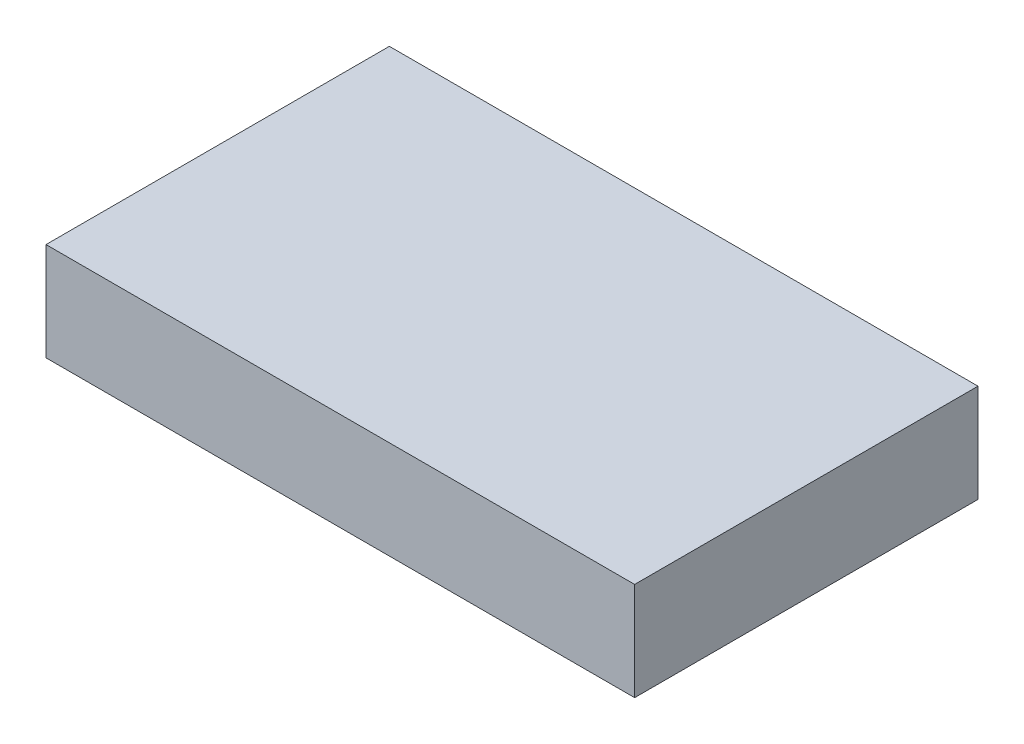
ISO-10303-21;
HEADER;
FILE_DESCRIPTION(('STEP AP214'),'2;1');
FILE_NAME('part.step','',(''),(''),'','','');
FILE_SCHEMA(('AUTOMOTIVE_DESIGN { 1 0 10303 214 1 1 1 1 }'));
ENDSEC;
DATA;
#1=APPLICATION_CONTEXT('core data for automotive mechanical design processes');
#2=APPLICATION_PROTOCOL_DEFINITION('international standard','automotive_design',2000,#1);
#3=PRODUCT_CONTEXT('',#1,'mechanical');
#4=PRODUCT('Part','Part','',(#3));
#5=PRODUCT_RELATED_PRODUCT_CATEGORY('part','',(#4));
#6=PRODUCT_DEFINITION_FORMATION('','',#4);
#7=PRODUCT_DEFINITION_CONTEXT('part definition',#1,'design');
#8=PRODUCT_DEFINITION('design','',#6,#7);
#9=PRODUCT_DEFINITION_SHAPE('','',#8);
#10=(LENGTH_UNIT() NAMED_UNIT(*) SI_UNIT(.MILLI.,.METRE.));
#11=(NAMED_UNIT(*) PLANE_ANGLE_UNIT() SI_UNIT($,.RADIAN.));
#12=(NAMED_UNIT(*) SI_UNIT($,.STERADIAN.) SOLID_ANGLE_UNIT());
#13=UNCERTAINTY_MEASURE_WITH_UNIT(LENGTH_MEASURE(1.E-05),#10,'distance_accuracy_value','');
#14=(GEOMETRIC_REPRESENTATION_CONTEXT(3) GLOBAL_UNCERTAINTY_ASSIGNED_CONTEXT((#13)) GLOBAL_UNIT_ASSIGNED_CONTEXT((#10,
#11,#12)) REPRESENTATION_CONTEXT('',''));
#15=CARTESIAN_POINT('',(0.,0.,0.));
#16=DIRECTION('',(0.,0.,1.));
#17=DIRECTION('',(1.,0.,0.));
#18=AXIS2_PLACEMENT_3D('',#15,#16,#17);
#19=CARTESIAN_POINT('',(60.,20.,-35.));
#20=DIRECTION('',(-1.,0.,0.));
#21=DIRECTION('',(0.,0.,1.));
#22=AXIS2_PLACEMENT_3D('',#19,#20,#21);
#23=PLANE('',#22);
#24=DIRECTION('',(0.,0.,-1.));
#25=VECTOR('',#24,1.);
#26=CARTESIAN_POINT('',(60.,0.,-35.));
#27=LINE('',#26,#25);
#28=CARTESIAN_POINT('',(60.,0.,35.));
#29=VERTEX_POINT('',#28);
#30=CARTESIAN_POINT('',(60.,0.,-35.));
#31=VERTEX_POINT('',#30);
#32=EDGE_CURVE('E100',#29,#31,#27,.T.);
#33=ORIENTED_EDGE('',*,*,#32,.T.);
#34=DIRECTION('',(0.,-1.,0.));
#35=VECTOR('',#34,1.);
#36=CARTESIAN_POINT('',(60.,20.,-35.));
#37=LINE('',#36,#35);
#38=CARTESIAN_POINT('',(60.,20.,-35.));
#39=VERTEX_POINT('',#38);
#40=EDGE_CURVE('E11',#39,#31,#37,.T.);
#41=ORIENTED_EDGE('',*,*,#40,.F.);
#42=DIRECTION('',(0.,0.,-1.));
#43=VECTOR('',#42,1.);
#44=CARTESIAN_POINT('',(60.,20.,-35.));
#45=LINE('',#44,#43);
#46=CARTESIAN_POINT('',(60.,20.,35.));
#47=VERTEX_POINT('',#46);
#48=EDGE_CURVE('E88',#47,#39,#45,.T.);
#49=ORIENTED_EDGE('',*,*,#48,.F.);
#50=DIRECTION('',(0.,-1.,0.));
#51=VECTOR('',#50,1.);
#52=CARTESIAN_POINT('',(60.,20.,35.));
#53=LINE('',#52,#51);
#54=EDGE_CURVE('E96',#47,#29,#53,.T.);
#55=ORIENTED_EDGE('',*,*,#54,.T.);
#56=EDGE_LOOP('',(#33,#41,#49,#55));
#57=FACE_BOUND('',#56,.T.);
#58=ADVANCED_FACE('F37',(#57),#23,.F.);
#59=CARTESIAN_POINT('',(-60.,20.,-35.));
#60=DIRECTION('',(0.,0.,1.));
#61=DIRECTION('',(1.,0.,0.));
#62=AXIS2_PLACEMENT_3D('',#59,#60,#61);
#63=PLANE('',#62);
#64=DIRECTION('',(-1.,0.,0.));
#65=VECTOR('',#64,1.);
#66=CARTESIAN_POINT('',(-60.,0.,-35.));
#67=LINE('',#66,#65);
#68=CARTESIAN_POINT('',(-60.,0.,-35.));
#69=VERTEX_POINT('',#68);
#70=EDGE_CURVE('E92',#31,#69,#67,.T.);
#71=ORIENTED_EDGE('',*,*,#70,.T.);
#72=DIRECTION('',(0.,-1.,0.));
#73=VECTOR('',#72,1.);
#74=CARTESIAN_POINT('',(-60.,20.,-35.));
#75=LINE('',#74,#73);
#76=CARTESIAN_POINT('',(-60.,20.,-35.));
#77=VERTEX_POINT('',#76);
#78=EDGE_CURVE('E45',#77,#69,#75,.T.);
#79=ORIENTED_EDGE('',*,*,#78,.F.);
#80=DIRECTION('',(-1.,0.,0.));
#81=VECTOR('',#80,1.);
#82=CARTESIAN_POINT('',(-60.,20.,-35.));
#83=LINE('',#82,#81);
#84=EDGE_CURVE('E83',#39,#77,#83,.T.);
#85=ORIENTED_EDGE('',*,*,#84,.F.);
#86=ORIENTED_EDGE('',*,*,#40,.T.);
#87=EDGE_LOOP('',(#71,#79,#85,#86));
#88=FACE_BOUND('',#87,.T.);
#89=ADVANCED_FACE('F91',(#88),#63,.F.);
#90=CARTESIAN_POINT('',(-60.,20.,-35.));
#91=DIRECTION('',(1.,0.,0.));
#92=DIRECTION('',(0.,0.,-1.));
#93=AXIS2_PLACEMENT_3D('',#90,#91,#92);
#94=PLANE('',#93);
#95=DIRECTION('',(0.,0.,1.));
#96=VECTOR('',#95,1.);
#97=CARTESIAN_POINT('',(-60.,0.,-35.));
#98=LINE('',#97,#96);
#99=CARTESIAN_POINT('',(-60.,0.,35.));
#100=VERTEX_POINT('',#99);
#101=EDGE_CURVE('E70',#69,#100,#98,.T.);
#102=ORIENTED_EDGE('',*,*,#101,.T.);
#103=DIRECTION('',(0.,-1.,0.));
#104=VECTOR('',#103,1.);
#105=CARTESIAN_POINT('',(-60.,20.,35.));
#106=LINE('',#105,#104);
#107=CARTESIAN_POINT('',(-60.,20.,35.));
#108=VERTEX_POINT('',#107);
#109=EDGE_CURVE('E93',#108,#100,#106,.T.);
#110=ORIENTED_EDGE('',*,*,#109,.F.);
#111=DIRECTION('',(0.,0.,1.));
#112=VECTOR('',#111,1.);
#113=CARTESIAN_POINT('',(-60.,20.,-35.));
#114=LINE('',#113,#112);
#115=EDGE_CURVE('E86',#77,#108,#114,.T.);
#116=ORIENTED_EDGE('',*,*,#115,.F.);
#117=ORIENTED_EDGE('',*,*,#78,.T.);
#118=EDGE_LOOP('',(#102,#110,#116,#117));
#119=FACE_BOUND('',#118,.T.);
#120=ADVANCED_FACE('F94',(#119),#94,.F.);
#121=CARTESIAN_POINT('',(-60.,20.,35.));
#122=DIRECTION('',(0.,0.,-1.));
#123=DIRECTION('',(-1.,0.,0.));
#124=AXIS2_PLACEMENT_3D('',#121,#122,#123);
#125=PLANE('',#124);
#126=DIRECTION('',(1.,0.,0.));
#127=VECTOR('',#126,1.);
#128=CARTESIAN_POINT('',(-60.,0.,35.));
#129=LINE('',#128,#127);
#130=EDGE_CURVE('E76',#100,#29,#129,.T.);
#131=ORIENTED_EDGE('',*,*,#130,.T.);
#132=ORIENTED_EDGE('',*,*,#54,.F.);
#133=DIRECTION('',(1.,0.,0.));
#134=VECTOR('',#133,1.);
#135=CARTESIAN_POINT('',(-60.,20.,35.));
#136=LINE('',#135,#134);
#137=EDGE_CURVE('E53',#108,#47,#136,.T.);
#138=ORIENTED_EDGE('',*,*,#137,.F.);
#139=ORIENTED_EDGE('',*,*,#109,.T.);
#140=EDGE_LOOP('',(#131,#132,#138,#139));
#141=FACE_BOUND('',#140,.T.);
#142=ADVANCED_FACE('F107',(#141),#125,.F.);
#143=CARTESIAN_POINT('',(0.,20.,0.));
#144=DIRECTION('',(0.,1.,0.));
#145=DIRECTION('',(0.,0.,1.));
#146=AXIS2_PLACEMENT_3D('',#143,#144,#145);
#147=PLANE('',#146);
#148=ORIENTED_EDGE('',*,*,#48,.T.);
#149=ORIENTED_EDGE('',*,*,#84,.T.);
#150=ORIENTED_EDGE('',*,*,#115,.T.);
#151=ORIENTED_EDGE('',*,*,#137,.T.);
#152=EDGE_LOOP('',(#148,#149,#150,#151));
#153=FACE_BOUND('',#152,.T.);
#154=ADVANCED_FACE('F84',(#153),#147,.T.);
#155=CARTESIAN_POINT('',(0.,0.,0.));
#156=DIRECTION('',(0.,1.,0.));
#157=DIRECTION('',(0.,0.,1.));
#158=AXIS2_PLACEMENT_3D('',#155,#156,#157);
#159=PLANE('',#158);
#160=ORIENTED_EDGE('',*,*,#32,.F.);
#161=ORIENTED_EDGE('',*,*,#130,.F.);
#162=ORIENTED_EDGE('',*,*,#101,.F.);
#163=ORIENTED_EDGE('',*,*,#70,.F.);
#164=EDGE_LOOP('',(#160,#161,#162,#163));
#165=FACE_BOUND('',#164,.T.);
#166=ADVANCED_FACE('F110',(#165),#159,.F.);
#167=CLOSED_SHELL('',(#58,#89,#120,#142,#154,#166));
#168=MANIFOLD_SOLID_BREP('B2',#167);
#169=ADVANCED_BREP_SHAPE_REPRESENTATION('',(#18,#168),#14);
#170=SHAPE_DEFINITION_REPRESENTATION(#9,#169);
ENDSEC;
END-ISO-10303-21;
